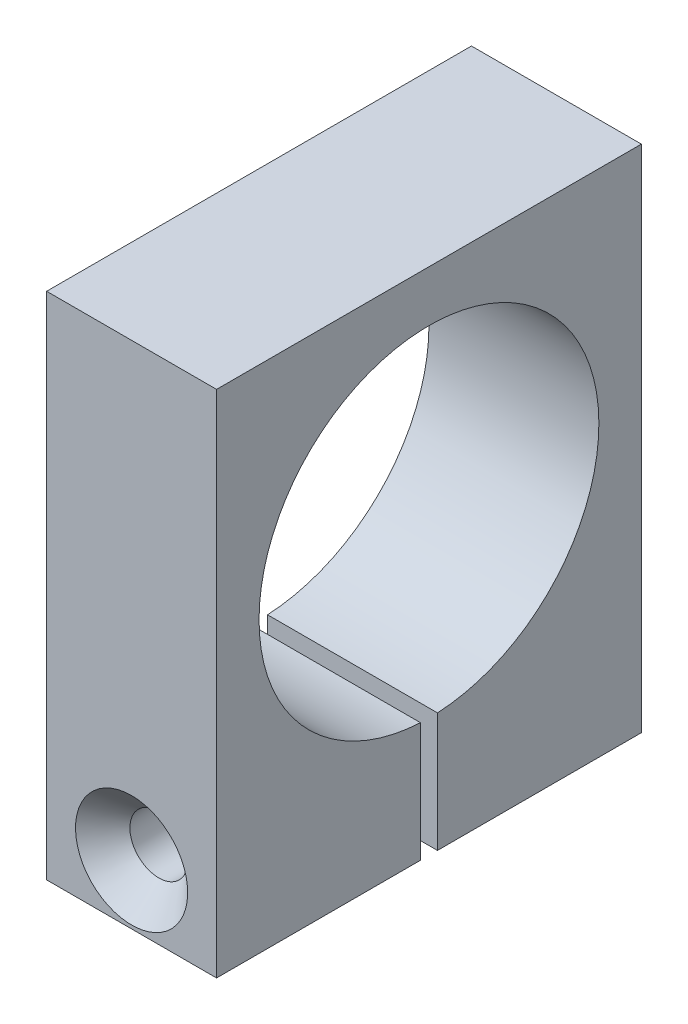
ISO-10303-21;
HEADER;
FILE_DESCRIPTION(('STEP AP214'),'2;1');
FILE_NAME('part.step','',(''),(''),'','','');
FILE_SCHEMA(('AUTOMOTIVE_DESIGN { 1 0 10303 214 1 1 1 1 }'));
ENDSEC;
DATA;
#1=APPLICATION_CONTEXT('core data for automotive mechanical design processes');
#2=APPLICATION_PROTOCOL_DEFINITION('international standard','automotive_design',2000,#1);
#3=PRODUCT_CONTEXT('',#1,'mechanical');
#4=PRODUCT('Part','Part','',(#3));
#5=PRODUCT_RELATED_PRODUCT_CATEGORY('part','',(#4));
#6=PRODUCT_DEFINITION_FORMATION('','',#4);
#7=PRODUCT_DEFINITION_CONTEXT('part definition',#1,'design');
#8=PRODUCT_DEFINITION('design','',#6,#7);
#9=PRODUCT_DEFINITION_SHAPE('','',#8);
#10=(LENGTH_UNIT() NAMED_UNIT(*) SI_UNIT(.MILLI.,.METRE.));
#11=(NAMED_UNIT(*) PLANE_ANGLE_UNIT() SI_UNIT($,.RADIAN.));
#12=(NAMED_UNIT(*) SI_UNIT($,.STERADIAN.) SOLID_ANGLE_UNIT());
#13=UNCERTAINTY_MEASURE_WITH_UNIT(LENGTH_MEASURE(1.E-05),#10,'distance_accuracy_value','');
#14=(GEOMETRIC_REPRESENTATION_CONTEXT(3) GLOBAL_UNCERTAINTY_ASSIGNED_CONTEXT((#13)) GLOBAL_UNIT_ASSIGNED_CONTEXT((#10,
#11,#12)) REPRESENTATION_CONTEXT('',''));
#15=CARTESIAN_POINT('',(0.,0.,0.));
#16=DIRECTION('',(0.,0.,1.));
#17=DIRECTION('',(1.,0.,0.));
#18=AXIS2_PLACEMENT_3D('',#15,#16,#17);
#19=CARTESIAN_POINT('',(0.,12.,-12.5));
#20=DIRECTION('',(0.,0.,1.));
#21=DIRECTION('',(0.,1.,0.));
#22=AXIS2_PLACEMENT_3D('',#19,#20,#21);
#23=CYLINDRICAL_SURFACE('',#22,1.2295);
#24=CARTESIAN_POINT('',(0.,12.,-6.50000000000001));
#25=DIRECTION('',(0.,0.,1.));
#26=DIRECTION('',(0.,-1.,0.));
#27=AXIS2_PLACEMENT_3D('',#24,#25,#26);
#28=CIRCLE('',#27,1.2295);
#29=CARTESIAN_POINT('',(0.,10.7705,-6.50000000000001));
#30=VERTEX_POINT('',#29);
#31=EDGE_CURVE('E169',#30,#30,#28,.T.);
#32=ORIENTED_EDGE('',*,*,#31,.T.);
#33=EDGE_LOOP('',(#32));
#34=FACE_BOUND('',#33,.T.);
#35=CARTESIAN_POINT('',(0.,12.,-7.50000000000001));
#36=DIRECTION('',(0.,0.,-1.));
#37=DIRECTION('',(0.,1.,0.));
#38=AXIS2_PLACEMENT_3D('',#35,#36,#37);
#39=CIRCLE('',#38,1.2295);
#40=CARTESIAN_POINT('',(0.,13.2295,-7.50000000000001));
#41=VERTEX_POINT('',#40);
#42=EDGE_CURVE('E11',#41,#41,#39,.T.);
#43=ORIENTED_EDGE('',*,*,#42,.T.);
#44=EDGE_LOOP('',(#43));
#45=FACE_BOUND('',#44,.T.);
#46=ADVANCED_FACE('F17',(#34,#45),#23,.F.);
#47=CARTESIAN_POINT('',(5.,-15.,-12.5));
#48=DIRECTION('',(0.,-1.,0.));
#49=DIRECTION('',(0.,0.,-1.));
#50=AXIS2_PLACEMENT_3D('',#47,#48,#49);
#51=PLANE('',#50);
#52=DIRECTION('',(0.,0.,1.));
#53=VECTOR('',#52,1.);
#54=CARTESIAN_POINT('',(5.,-15.,-12.5));
#55=LINE('',#54,#53);
#56=CARTESIAN_POINT('',(5.,-15.,-12.5));
#57=VERTEX_POINT('',#56);
#58=CARTESIAN_POINT('',(5.,-15.,-0.500000000000002));
#59=VERTEX_POINT('',#58);
#60=EDGE_CURVE('E204',#57,#59,#55,.T.);
#61=ORIENTED_EDGE('',*,*,#60,.T.);
#62=DIRECTION('',(1.,0.,0.));
#63=VECTOR('',#62,1.);
#64=CARTESIAN_POINT('',(-35.3112887414928,-15.,-0.500000000000002));
#65=LINE('',#64,#63);
#66=CARTESIAN_POINT('',(-5.,-15.,-0.500000000000002));
#67=VERTEX_POINT('',#66);
#68=EDGE_CURVE('E195',#67,#59,#65,.T.);
#69=ORIENTED_EDGE('',*,*,#68,.F.);
#70=DIRECTION('',(0.,0.,1.));
#71=VECTOR('',#70,1.);
#72=CARTESIAN_POINT('',(-5.,-15.,-12.5));
#73=LINE('',#72,#71);
#74=CARTESIAN_POINT('',(-5.,-15.,-12.5));
#75=VERTEX_POINT('',#74);
#76=EDGE_CURVE('E214',#75,#67,#73,.T.);
#77=ORIENTED_EDGE('',*,*,#76,.F.);
#78=DIRECTION('',(-1.,0.,0.));
#79=VECTOR('',#78,1.);
#80=CARTESIAN_POINT('',(5.,-15.,-12.5));
#81=LINE('',#80,#79);
#82=EDGE_CURVE('E226',#57,#75,#81,.T.);
#83=ORIENTED_EDGE('',*,*,#82,.F.);
#84=EDGE_LOOP('',(#61,#69,#77,#83));
#85=FACE_BOUND('',#84,.T.);
#86=ADVANCED_FACE('F112',(#85),#51,.T.);
#87=CARTESIAN_POINT('',(-5.,-15.,0.500000000000008));
#88=VERTEX_POINT('',#87);
#89=CARTESIAN_POINT('',(-5.,-15.,12.5));
#90=VERTEX_POINT('',#89);
#91=EDGE_CURVE('E213',#88,#90,#73,.T.);
#92=ORIENTED_EDGE('',*,*,#91,.F.);
#93=DIRECTION('',(1.,0.,0.));
#94=VECTOR('',#93,1.);
#95=CARTESIAN_POINT('',(-35.3112887414928,-15.,0.500000000000008));
#96=LINE('',#95,#94);
#97=CARTESIAN_POINT('',(5.,-15.,0.500000000000008));
#98=VERTEX_POINT('',#97);
#99=EDGE_CURVE('E192',#88,#98,#96,.T.);
#100=ORIENTED_EDGE('',*,*,#99,.T.);
#101=CARTESIAN_POINT('',(5.,-15.,12.5));
#102=VERTEX_POINT('',#101);
#103=EDGE_CURVE('E202',#98,#102,#55,.T.);
#104=ORIENTED_EDGE('',*,*,#103,.T.);
#105=DIRECTION('',(-1.,0.,0.));
#106=VECTOR('',#105,1.);
#107=CARTESIAN_POINT('',(5.,-15.,12.5));
#108=LINE('',#107,#106);
#109=EDGE_CURVE('E223',#102,#90,#108,.T.);
#110=ORIENTED_EDGE('',*,*,#109,.T.);
#111=EDGE_LOOP('',(#92,#100,#104,#110));
#112=FACE_BOUND('',#111,.T.);
#113=ADVANCED_FACE('F117',(#112),#51,.T.);
#114=CARTESIAN_POINT('',(5.,0.,0.));
#115=DIRECTION('',(-1.,0.,0.));
#116=DIRECTION('',(0.,-1.,0.));
#117=AXIS2_PLACEMENT_3D('',#114,#115,#116);
#118=PLANE('',#117);
#119=DIRECTION('',(0.,-1.,0.));
#120=VECTOR('',#119,1.);
#121=CARTESIAN_POINT('',(5.,-7.98749217771909,-0.500000000000001));
#122=LINE('',#121,#120);
#123=CARTESIAN_POINT('',(5.,-7.98749217771909,-0.500000000000001));
#124=VERTEX_POINT('',#123);
#125=EDGE_CURVE('E179',#124,#59,#122,.T.);
#126=ORIENTED_EDGE('',*,*,#125,.T.);
#127=ORIENTED_EDGE('',*,*,#60,.F.);
#128=DIRECTION('',(0.,-1.,0.));
#129=VECTOR('',#128,1.);
#130=CARTESIAN_POINT('',(5.,15.,-12.5));
#131=LINE('',#130,#129);
#132=CARTESIAN_POINT('',(5.,15.,-12.5));
#133=VERTEX_POINT('',#132);
#134=EDGE_CURVE('E200',#133,#57,#131,.T.);
#135=ORIENTED_EDGE('',*,*,#134,.F.);
#136=DIRECTION('',(0.,0.,-1.));
#137=VECTOR('',#136,1.);
#138=CARTESIAN_POINT('',(5.,15.,12.5));
#139=LINE('',#138,#137);
#140=CARTESIAN_POINT('',(5.,15.,12.5));
#141=VERTEX_POINT('',#140);
#142=EDGE_CURVE('E203',#141,#133,#139,.T.);
#143=ORIENTED_EDGE('',*,*,#142,.F.);
#144=DIRECTION('',(0.,1.,0.));
#145=VECTOR('',#144,1.);
#146=CARTESIAN_POINT('',(5.,-15.,12.5));
#147=LINE('',#146,#145);
#148=EDGE_CURVE('E207',#102,#141,#147,.T.);
#149=ORIENTED_EDGE('',*,*,#148,.F.);
#150=ORIENTED_EDGE('',*,*,#103,.F.);
#151=DIRECTION('',(0.,1.,0.));
#152=VECTOR('',#151,1.);
#153=CARTESIAN_POINT('',(5.,-15.,0.500000000000008));
#154=LINE('',#153,#152);
#155=CARTESIAN_POINT('',(5.,-7.98749217771909,0.500000000000007));
#156=VERTEX_POINT('',#155);
#157=EDGE_CURVE('E183',#98,#156,#154,.T.);
#158=ORIENTED_EDGE('',*,*,#157,.T.);
#159=CARTESIAN_POINT('',(5.,2.,0.));
#160=DIRECTION('',(-1.,0.,0.));
#161=DIRECTION('',(0.,-1.,0.));
#162=AXIS2_PLACEMENT_3D('',#159,#160,#161);
#163=CIRCLE('',#162,10.);
#164=EDGE_CURVE('E178',#156,#124,#163,.T.);
#165=ORIENTED_EDGE('',*,*,#164,.T.);
#166=EDGE_LOOP('',(#126,#127,#135,#143,#149,#150,#158,#165));
#167=FACE_BOUND('',#166,.T.);
#168=ADVANCED_FACE('F134',(#167),#118,.F.);
#169=CARTESIAN_POINT('',(-5.,0.,0.));
#170=DIRECTION('',(-1.,0.,0.));
#171=DIRECTION('',(0.,-1.,0.));
#172=AXIS2_PLACEMENT_3D('',#169,#170,#171);
#173=PLANE('',#172);
#174=ORIENTED_EDGE('',*,*,#76,.T.);
#175=DIRECTION('',(0.,1.,0.));
#176=VECTOR('',#175,1.);
#177=CARTESIAN_POINT('',(-5.,0.,-0.5));
#178=LINE('',#177,#176);
#179=CARTESIAN_POINT('',(-5.,-7.98749217771909,-0.500000000000001));
#180=VERTEX_POINT('',#179);
#181=EDGE_CURVE('E26',#67,#180,#178,.T.);
#182=ORIENTED_EDGE('',*,*,#181,.T.);
#183=CARTESIAN_POINT('',(-5.,2.,0.));
#184=DIRECTION('',(-1.,0.,0.));
#185=DIRECTION('',(0.,-1.,0.));
#186=AXIS2_PLACEMENT_3D('',#183,#184,#185);
#187=CIRCLE('',#186,10.);
#188=CARTESIAN_POINT('',(-5.,-7.98749217771909,0.500000000000007));
#189=VERTEX_POINT('',#188);
#190=EDGE_CURVE('E230',#180,#189,#187,.F.);
#191=ORIENTED_EDGE('',*,*,#190,.T.);
#192=DIRECTION('',(0.,-1.,0.));
#193=VECTOR('',#192,1.);
#194=CARTESIAN_POINT('',(-5.,0.,0.500000000000007));
#195=LINE('',#194,#193);
#196=EDGE_CURVE('E229',#189,#88,#195,.T.);
#197=ORIENTED_EDGE('',*,*,#196,.T.);
#198=ORIENTED_EDGE('',*,*,#91,.T.);
#199=DIRECTION('',(0.,1.,0.));
#200=VECTOR('',#199,1.);
#201=CARTESIAN_POINT('',(-5.,-15.,12.5));
#202=LINE('',#201,#200);
#203=CARTESIAN_POINT('',(-5.,15.,12.5));
#204=VERTEX_POINT('',#203);
#205=EDGE_CURVE('E210',#90,#204,#202,.T.);
#206=ORIENTED_EDGE('',*,*,#205,.T.);
#207=DIRECTION('',(0.,0.,-1.));
#208=VECTOR('',#207,1.);
#209=CARTESIAN_POINT('',(-5.,15.,12.5));
#210=LINE('',#209,#208);
#211=CARTESIAN_POINT('',(-5.,15.,-12.5));
#212=VERTEX_POINT('',#211);
#213=EDGE_CURVE('E199',#204,#212,#210,.T.);
#214=ORIENTED_EDGE('',*,*,#213,.T.);
#215=DIRECTION('',(0.,-1.,0.));
#216=VECTOR('',#215,1.);
#217=CARTESIAN_POINT('',(-5.,15.,-12.5));
#218=LINE('',#217,#216);
#219=EDGE_CURVE('E155',#212,#75,#218,.T.);
#220=ORIENTED_EDGE('',*,*,#219,.T.);
#221=EDGE_LOOP('',(#174,#182,#191,#197,#198,#206,#214,#220));
#222=FACE_BOUND('',#221,.T.);
#223=ADVANCED_FACE('F137',(#222),#173,.T.);
#224=CARTESIAN_POINT('',(5.,15.,12.5));
#225=DIRECTION('',(0.,1.,0.));
#226=DIRECTION('',(0.,0.,1.));
#227=AXIS2_PLACEMENT_3D('',#224,#225,#226);
#228=PLANE('',#227);
#229=ORIENTED_EDGE('',*,*,#213,.F.);
#230=DIRECTION('',(-1.,0.,0.));
#231=VECTOR('',#230,1.);
#232=CARTESIAN_POINT('',(5.,15.,12.5));
#233=LINE('',#232,#231);
#234=EDGE_CURVE('E41',#141,#204,#233,.T.);
#235=ORIENTED_EDGE('',*,*,#234,.F.);
#236=ORIENTED_EDGE('',*,*,#142,.T.);
#237=DIRECTION('',(-1.,0.,0.));
#238=VECTOR('',#237,1.);
#239=CARTESIAN_POINT('',(5.,15.,-12.5));
#240=LINE('',#239,#238);
#241=EDGE_CURVE('E67',#133,#212,#240,.T.);
#242=ORIENTED_EDGE('',*,*,#241,.T.);
#243=EDGE_LOOP('',(#229,#235,#236,#242));
#244=FACE_BOUND('',#243,.T.);
#245=ADVANCED_FACE('F19',(#244),#228,.T.);
#246=CARTESIAN_POINT('',(5.,15.,-12.5));
#247=DIRECTION('',(0.,0.,-1.));
#248=DIRECTION('',(-1.,0.,0.));
#249=AXIS2_PLACEMENT_3D('',#246,#247,#248);
#250=PLANE('',#249);
#251=CARTESIAN_POINT('',(0.,12.,-12.5));
#252=DIRECTION('',(0.,0.,1.));
#253=DIRECTION('',(0.,1.,0.));
#254=AXIS2_PLACEMENT_3D('',#251,#252,#253);
#255=CIRCLE('',#254,1.2295);
#256=CARTESIAN_POINT('',(0.,13.2295,-12.5));
#257=VERTEX_POINT('',#256);
#258=EDGE_CURVE('E152',#257,#257,#255,.T.);
#259=ORIENTED_EDGE('',*,*,#258,.T.);
#260=EDGE_LOOP('',(#259));
#261=FACE_BOUND('',#260,.T.);
#262=ORIENTED_EDGE('',*,*,#219,.F.);
#263=ORIENTED_EDGE('',*,*,#241,.F.);
#264=ORIENTED_EDGE('',*,*,#134,.T.);
#265=ORIENTED_EDGE('',*,*,#82,.T.);
#266=EDGE_LOOP('',(#262,#263,#264,#265));
#267=FACE_BOUND('',#266,.T.);
#268=CARTESIAN_POINT('',(0.,-11.5,-12.5));
#269=DIRECTION('',(0.,0.,-1.));
#270=DIRECTION('',(0.,1.,0.));
#271=AXIS2_PLACEMENT_3D('',#268,#269,#270);
#272=CIRCLE('',#271,1.2295);
#273=CARTESIAN_POINT('',(0.,-10.2705,-12.5));
#274=VERTEX_POINT('',#273);
#275=EDGE_CURVE('E159',#274,#274,#272,.T.);
#276=ORIENTED_EDGE('',*,*,#275,.F.);
#277=EDGE_LOOP('',(#276));
#278=FACE_BOUND('',#277,.T.);
#279=ADVANCED_FACE('F143',(#261,#267,#278),#250,.T.);
#280=CARTESIAN_POINT('',(5.,-15.,12.5));
#281=DIRECTION('',(0.,0.,1.));
#282=DIRECTION('',(0.,-1.,0.));
#283=AXIS2_PLACEMENT_3D('',#280,#281,#282);
#284=PLANE('',#283);
#285=CARTESIAN_POINT('',(0.,-11.5,12.5));
#286=DIRECTION('',(0.,0.,-1.));
#287=DIRECTION('',(0.,1.,0.));
#288=AXIS2_PLACEMENT_3D('',#285,#286,#287);
#289=CIRCLE('',#288,3.3);
#290=CARTESIAN_POINT('',(0.,-8.20000000000001,12.5));
#291=VERTEX_POINT('',#290);
#292=EDGE_CURVE('E172',#291,#291,#289,.T.);
#293=ORIENTED_EDGE('',*,*,#292,.T.);
#294=EDGE_LOOP('',(#293));
#295=FACE_BOUND('',#294,.T.);
#296=ORIENTED_EDGE('',*,*,#205,.F.);
#297=ORIENTED_EDGE('',*,*,#109,.F.);
#298=ORIENTED_EDGE('',*,*,#148,.T.);
#299=ORIENTED_EDGE('',*,*,#234,.T.);
#300=EDGE_LOOP('',(#296,#297,#298,#299));
#301=FACE_BOUND('',#300,.T.);
#302=ADVANCED_FACE('F132',(#295,#301),#284,.T.);
#303=CARTESIAN_POINT('',(-35.3112887414928,2.,0.));
#304=DIRECTION('',(1.,0.,0.));
#305=DIRECTION('',(0.,1.,0.));
#306=AXIS2_PLACEMENT_3D('',#303,#304,#305);
#307=CYLINDRICAL_SURFACE('',#306,10.);
#308=DIRECTION('',(1.,0.,0.));
#309=VECTOR('',#308,1.);
#310=CARTESIAN_POINT('',(-35.3112887414928,-7.98749217771909,-0.500000000000001));
#311=LINE('',#310,#309);
#312=EDGE_CURVE('E197',#180,#124,#311,.T.);
#313=ORIENTED_EDGE('',*,*,#312,.T.);
#314=ORIENTED_EDGE('',*,*,#164,.F.);
#315=DIRECTION('',(1.,0.,0.));
#316=VECTOR('',#315,1.);
#317=CARTESIAN_POINT('',(-35.3112887414928,-7.98749217771909,0.500000000000007));
#318=LINE('',#317,#316);
#319=EDGE_CURVE('E187',#189,#156,#318,.T.);
#320=ORIENTED_EDGE('',*,*,#319,.F.);
#321=ORIENTED_EDGE('',*,*,#190,.F.);
#322=EDGE_LOOP('',(#313,#314,#320,#321));
#323=FACE_BOUND('',#322,.T.);
#324=ADVANCED_FACE('F129',(#323),#307,.F.);
#325=CARTESIAN_POINT('',(-35.3112887414928,-7.98749217771909,-0.500000000000001));
#326=DIRECTION('',(0.,0.,1.));
#327=DIRECTION('',(0.,-1.,0.));
#328=AXIS2_PLACEMENT_3D('',#325,#326,#327);
#329=PLANE('',#328);
#330=ORIENTED_EDGE('',*,*,#68,.T.);
#331=ORIENTED_EDGE('',*,*,#125,.F.);
#332=ORIENTED_EDGE('',*,*,#312,.F.);
#333=ORIENTED_EDGE('',*,*,#181,.F.);
#334=EDGE_LOOP('',(#330,#331,#332,#333));
#335=FACE_BOUND('',#334,.T.);
#336=CARTESIAN_POINT('',(0.,-11.5,-0.5));
#337=DIRECTION('',(0.,0.,1.));
#338=DIRECTION('',(0.,-1.,0.));
#339=AXIS2_PLACEMENT_3D('',#336,#337,#338);
#340=CIRCLE('',#339,1.2295);
#341=CARTESIAN_POINT('',(0.,-12.7295,-0.500000000000001));
#342=VERTEX_POINT('',#341);
#343=EDGE_CURVE('E161',#342,#342,#340,.T.);
#344=ORIENTED_EDGE('',*,*,#343,.F.);
#345=EDGE_LOOP('',(#344));
#346=FACE_BOUND('',#345,.T.);
#347=ADVANCED_FACE('F125',(#335,#346),#329,.T.);
#348=CARTESIAN_POINT('',(-35.3112887414928,-15.,0.500000000000008));
#349=DIRECTION('',(0.,0.,-1.));
#350=DIRECTION('',(0.,1.,0.));
#351=AXIS2_PLACEMENT_3D('',#348,#349,#350);
#352=PLANE('',#351);
#353=CARTESIAN_POINT('',(0.,-11.5,0.500000000000007));
#354=DIRECTION('',(0.,0.,-1.));
#355=DIRECTION('',(0.,1.,0.));
#356=AXIS2_PLACEMENT_3D('',#353,#354,#355);
#357=CIRCLE('',#356,1.7);
#358=CARTESIAN_POINT('',(0.,-9.8,0.500000000000007));
#359=VERTEX_POINT('',#358);
#360=EDGE_CURVE('E162',#359,#359,#357,.T.);
#361=ORIENTED_EDGE('',*,*,#360,.F.);
#362=EDGE_LOOP('',(#361));
#363=FACE_BOUND('',#362,.T.);
#364=ORIENTED_EDGE('',*,*,#319,.T.);
#365=ORIENTED_EDGE('',*,*,#157,.F.);
#366=ORIENTED_EDGE('',*,*,#99,.F.);
#367=ORIENTED_EDGE('',*,*,#196,.F.);
#368=EDGE_LOOP('',(#364,#365,#366,#367));
#369=FACE_BOUND('',#368,.T.);
#370=ADVANCED_FACE('F107',(#363,#369),#352,.T.);
#371=ORIENTED_EDGE('',*,*,#42,.F.);
#372=EDGE_LOOP('',(#371));
#373=FACE_BOUND('',#372,.T.);
#374=ORIENTED_EDGE('',*,*,#258,.F.);
#375=EDGE_LOOP('',(#374));
#376=FACE_BOUND('',#375,.T.);
#377=ADVANCED_FACE('F96',(#373,#376),#23,.F.);
#378=CARTESIAN_POINT('',(0.,12.,-6.50000000000001));
#379=DIRECTION('',(0.,0.,-1.));
#380=DIRECTION('',(0.,-1.,0.));
#381=AXIS2_PLACEMENT_3D('',#378,#379,#380);
#382=CONICAL_SURFACE('',#381,1.2295,1.02974425867665);
#383=ORIENTED_EDGE('',*,*,#31,.F.);
#384=EDGE_LOOP('',(#383));
#385=FACE_BOUND('',#384,.T.);
#386=CARTESIAN_POINT('',(0.,12.,-5.76124186890562));
#387=VERTEX_POINT('',#386);
#388=VERTEX_LOOP('',#387);
#389=FACE_BOUND('',#388,.T.);
#390=ADVANCED_FACE('F93',(#385,#389),#382,.F.);
#391=CARTESIAN_POINT('',(0.,-11.5,27.8112887414928));
#392=DIRECTION('',(0.,0.,-1.));
#393=DIRECTION('',(-1.,0.,0.));
#394=AXIS2_PLACEMENT_3D('',#391,#392,#393);
#395=CYLINDRICAL_SURFACE('',#394,1.2295);
#396=ORIENTED_EDGE('',*,*,#275,.T.);
#397=EDGE_LOOP('',(#396));
#398=FACE_BOUND('',#397,.T.);
#399=ORIENTED_EDGE('',*,*,#343,.T.);
#400=EDGE_LOOP('',(#399));
#401=FACE_BOUND('',#400,.T.);
#402=ADVANCED_FACE('F95',(#398,#401),#395,.F.);
#403=CARTESIAN_POINT('',(0.,-11.5,-29.4112887414928));
#404=DIRECTION('',(0.,0.,1.));
#405=DIRECTION('',(0.,-1.,0.));
#406=AXIS2_PLACEMENT_3D('',#403,#404,#405);
#407=CYLINDRICAL_SURFACE('',#406,1.7);
#408=CARTESIAN_POINT('',(0.,-11.5,10.9));
#409=DIRECTION('',(0.,0.,1.));
#410=DIRECTION('',(0.,1.,0.));
#411=AXIS2_PLACEMENT_3D('',#408,#409,#410);
#412=CIRCLE('',#411,1.7);
#413=CARTESIAN_POINT('',(0.,-9.80000000000001,10.9));
#414=VERTEX_POINT('',#413);
#415=EDGE_CURVE('E520',#414,#414,#412,.T.);
#416=ORIENTED_EDGE('',*,*,#415,.T.);
#417=EDGE_LOOP('',(#416));
#418=FACE_BOUND('',#417,.T.);
#419=ORIENTED_EDGE('',*,*,#360,.T.);
#420=EDGE_LOOP('',(#419));
#421=FACE_BOUND('',#420,.T.);
#422=ADVANCED_FACE('F104',(#418,#421),#407,.F.);
#423=CARTESIAN_POINT('',(0.,-11.5,12.5));
#424=DIRECTION('',(0.,0.,1.));
#425=DIRECTION('',(0.,1.,0.));
#426=AXIS2_PLACEMENT_3D('',#423,#424,#425);
#427=CONICAL_SURFACE('',#426,3.3,0.785398163397448);
#428=ORIENTED_EDGE('',*,*,#292,.F.);
#429=EDGE_LOOP('',(#428));
#430=FACE_BOUND('',#429,.T.);
#431=ORIENTED_EDGE('',*,*,#415,.F.);
#432=EDGE_LOOP('',(#431));
#433=FACE_BOUND('',#432,.T.);
#434=ADVANCED_FACE('F291',(#430,#433),#427,.F.);
#435=CLOSED_SHELL('',(#46,#86,#113,#168,#223,#245,#279,#302,#324,#347,#370,#377,#390,#402,#422,#434));
#436=MANIFOLD_SOLID_BREP('B1',#435);
#437=ADVANCED_BREP_SHAPE_REPRESENTATION('',(#18,#436),#14);
#438=SHAPE_DEFINITION_REPRESENTATION(#9,#437);
ENDSEC;
END-ISO-10303-21;
